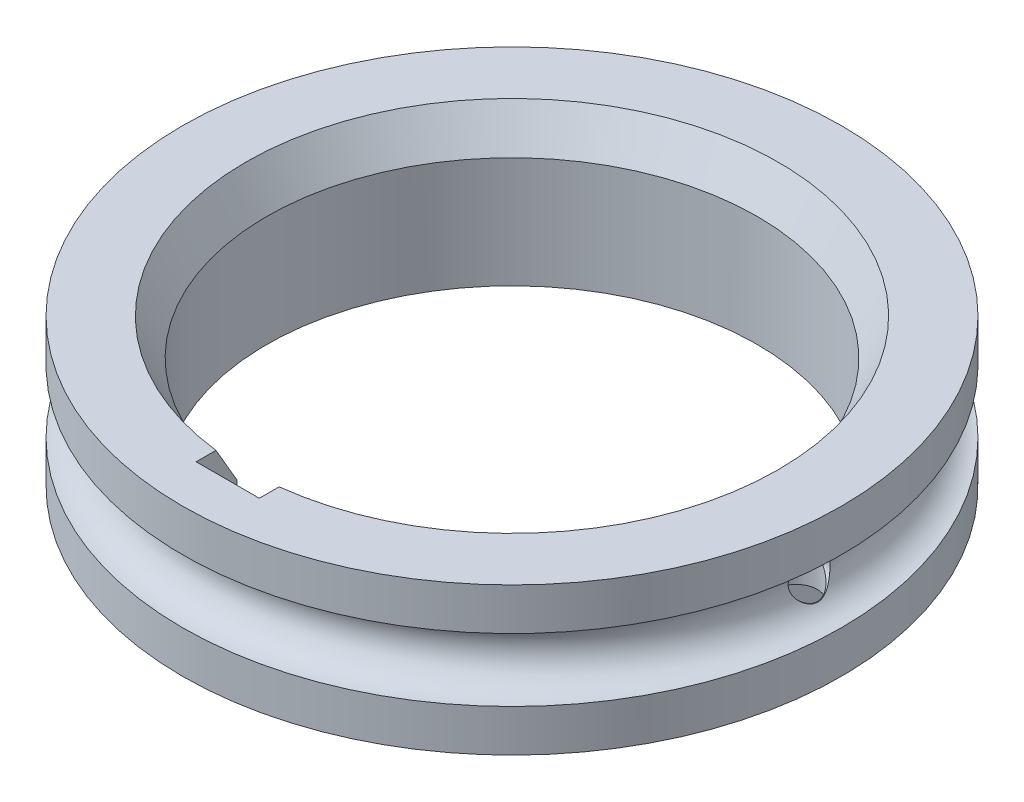
ISO-10303-21;
HEADER;
FILE_DESCRIPTION(('STEP AP214'),'2;1');
FILE_NAME('part.step','',(''),(''),'','','');
FILE_SCHEMA(('AUTOMOTIVE_DESIGN { 1 0 10303 214 1 1 1 1 }'));
ENDSEC;
DATA;
#1=APPLICATION_CONTEXT('core data for automotive mechanical design processes');
#2=APPLICATION_PROTOCOL_DEFINITION('international standard','automotive_design',2000,#1);
#3=PRODUCT_CONTEXT('',#1,'mechanical');
#4=PRODUCT('Part','Part','',(#3));
#5=PRODUCT_RELATED_PRODUCT_CATEGORY('part','',(#4));
#6=PRODUCT_DEFINITION_FORMATION('','',#4);
#7=PRODUCT_DEFINITION_CONTEXT('part definition',#1,'design');
#8=PRODUCT_DEFINITION('design','',#6,#7);
#9=PRODUCT_DEFINITION_SHAPE('','',#8);
#10=(LENGTH_UNIT() NAMED_UNIT(*) SI_UNIT(.MILLI.,.METRE.));
#11=(NAMED_UNIT(*) PLANE_ANGLE_UNIT() SI_UNIT($,.RADIAN.));
#12=(NAMED_UNIT(*) SI_UNIT($,.STERADIAN.) SOLID_ANGLE_UNIT());
#13=UNCERTAINTY_MEASURE_WITH_UNIT(LENGTH_MEASURE(1.E-05),#10,'distance_accuracy_value','');
#14=(GEOMETRIC_REPRESENTATION_CONTEXT(3) GLOBAL_UNCERTAINTY_ASSIGNED_CONTEXT((#13)) GLOBAL_UNIT_ASSIGNED_CONTEXT((#10,
#11,#12)) REPRESENTATION_CONTEXT('',''));
#15=CARTESIAN_POINT('',(0.,0.,0.));
#16=DIRECTION('',(0.,0.,1.));
#17=DIRECTION('',(1.,0.,0.));
#18=AXIS2_PLACEMENT_3D('',#15,#16,#17);
#19=CARTESIAN_POINT('',(0.,7.,0.));
#20=DIRECTION('',(0.,1.,0.));
#21=DIRECTION('',(0.,0.,1.));
#22=AXIS2_PLACEMENT_3D('',#19,#20,#21);
#23=PLANE('',#22);
#24=CARTESIAN_POINT('',(0.,7.,0.));
#25=DIRECTION('',(0.,1.,0.));
#26=DIRECTION('',(0.,0.,1.));
#27=AXIS2_PLACEMENT_3D('',#24,#25,#26);
#28=CIRCLE('',#27,15.65);
#29=CARTESIAN_POINT('',(0.,7.,15.65));
#30=VERTEX_POINT('',#29);
#31=EDGE_CURVE('E188',#30,#30,#28,.T.);
#32=ORIENTED_EDGE('',*,*,#31,.T.);
#33=EDGE_LOOP('',(#32));
#34=FACE_BOUND('',#33,.T.);
#35=CARTESIAN_POINT('',(0.,7.,0.));
#36=DIRECTION('',(0.,1.,0.));
#37=DIRECTION('',(0.,0.,1.));
#38=AXIS2_PLACEMENT_3D('',#35,#36,#37);
#39=CIRCLE('',#38,12.65);
#40=CARTESIAN_POINT('',(-1.5,7.,12.560752366001));
#41=VERTEX_POINT('',#40);
#42=CARTESIAN_POINT('',(1.5,7.,12.560752366001));
#43=VERTEX_POINT('',#42);
#44=EDGE_CURVE('E196',#41,#43,#39,.F.);
#45=ORIENTED_EDGE('',*,*,#44,.T.);
#46=DIRECTION('',(0.,0.,1.));
#47=VECTOR('',#46,1.);
#48=CARTESIAN_POINT('',(1.5,7.,0.));
#49=LINE('',#48,#47);
#50=CARTESIAN_POINT('',(1.5,7.,13.5));
#51=VERTEX_POINT('',#50);
#52=EDGE_CURVE('E342',#43,#51,#49,.T.);
#53=ORIENTED_EDGE('',*,*,#52,.T.);
#54=DIRECTION('',(-1.,0.,0.));
#55=VECTOR('',#54,1.);
#56=CARTESIAN_POINT('',(0.,7.,13.5));
#57=LINE('',#56,#55);
#58=CARTESIAN_POINT('',(-1.5,7.,13.5));
#59=VERTEX_POINT('',#58);
#60=EDGE_CURVE('E145',#51,#59,#57,.T.);
#61=ORIENTED_EDGE('',*,*,#60,.T.);
#62=DIRECTION('',(0.,0.,-1.));
#63=VECTOR('',#62,1.);
#64=CARTESIAN_POINT('',(-1.5,7.,0.));
#65=LINE('',#64,#63);
#66=EDGE_CURVE('E135',#59,#41,#65,.T.);
#67=ORIENTED_EDGE('',*,*,#66,.T.);
#68=EDGE_LOOP('',(#45,#53,#61,#67));
#69=FACE_BOUND('',#68,.T.);
#70=ADVANCED_FACE('F41',(#34,#69),#23,.T.);
#71=CARTESIAN_POINT('',(0.,7.,0.));
#72=DIRECTION('',(0.,-1.,0.));
#73=DIRECTION('',(0.,0.,-1.));
#74=AXIS2_PLACEMENT_3D('',#71,#72,#73);
#75=CYLINDRICAL_SURFACE('',#74,11.65);
#76=CARTESIAN_POINT('',(0.,0.,0.));
#77=DIRECTION('',(0.,1.,0.));
#78=DIRECTION('',(0.,0.,1.));
#79=AXIS2_PLACEMENT_3D('',#76,#77,#78);
#80=CIRCLE('',#79,11.65);
#81=CARTESIAN_POINT('',(0.,0.,11.65));
#82=VERTEX_POINT('',#81);
#83=EDGE_CURVE('E183',#82,#82,#80,.T.);
#84=ORIENTED_EDGE('',*,*,#83,.F.);
#85=EDGE_LOOP('',(#84));
#86=FACE_BOUND('',#85,.T.);
#87=CARTESIAN_POINT('',(0.,2.,0.));
#88=DIRECTION('',(0.,-1.,0.));
#89=DIRECTION('',(0.,0.,-1.));
#90=AXIS2_PLACEMENT_3D('',#87,#88,#89);
#91=CIRCLE('',#90,11.65);
#92=CARTESIAN_POINT('',(1.5,2.,11.5530299056135));
#93=VERTEX_POINT('',#92);
#94=CARTESIAN_POINT('',(-1.5,2.,11.5530299056135));
#95=VERTEX_POINT('',#94);
#96=EDGE_CURVE('E13',#93,#95,#91,.T.);
#97=ORIENTED_EDGE('',*,*,#96,.F.);
#98=DIRECTION('',(0.,-1.,0.));
#99=VECTOR('',#98,1.);
#100=CARTESIAN_POINT('',(1.5,7.,11.5530299056135));
#101=LINE('',#100,#99);
#102=CARTESIAN_POINT('',(1.5,5.26794919243111,11.5530299056135));
#103=VERTEX_POINT('',#102);
#104=EDGE_CURVE('E131',#93,#103,#101,.F.);
#105=ORIENTED_EDGE('',*,*,#104,.T.);
#106=CARTESIAN_POINT('',(0.,5.26794919243111,0.));
#107=DIRECTION('',(0.,1.,0.));
#108=DIRECTION('',(0.,0.,1.));
#109=AXIS2_PLACEMENT_3D('',#106,#107,#108);
#110=CIRCLE('',#109,11.65);
#111=CARTESIAN_POINT('',(-1.5,5.26794919243111,11.5530299056135));
#112=VERTEX_POINT('',#111);
#113=EDGE_CURVE('E191',#103,#112,#110,.T.);
#114=ORIENTED_EDGE('',*,*,#113,.T.);
#115=DIRECTION('',(0.,-1.,0.));
#116=VECTOR('',#115,1.);
#117=CARTESIAN_POINT('',(-1.5,7.,11.5530299056135));
#118=LINE('',#117,#116);
#119=EDGE_CURVE('E56',#112,#95,#118,.T.);
#120=ORIENTED_EDGE('',*,*,#119,.T.);
#121=EDGE_LOOP('',(#97,#105,#114,#120));
#122=FACE_BOUND('',#121,.T.);
#123=ADVANCED_FACE('F274',(#86,#122),#75,.F.);
#124=CARTESIAN_POINT('',(0.,5.26794919243111,0.));
#125=DIRECTION('',(0.,1.,0.));
#126=DIRECTION('',(0.,0.,1.));
#127=AXIS2_PLACEMENT_3D('',#124,#125,#126);
#128=CONICAL_SURFACE('',#127,11.65,0.523598775598299);
#129=ORIENTED_EDGE('',*,*,#113,.F.);
#130=CARTESIAN_POINT('',(1.5,-7.50027727997253,4.00668407312648));
#131=CARTESIAN_POINT('',(1.5,-7.29792213320085,4.13141607417199));
#132=CARTESIAN_POINT('',(1.5,-7.09526317837837,4.25565332553744));
#133=CARTESIAN_POINT('',(1.5,-6.68945247858701,4.50331809504595));
#134=CARTESIAN_POINT('',(1.5,-6.48630073637275,4.62674561770105));
#135=CARTESIAN_POINT('',(1.5,-6.07962058575542,4.87296992920971));
#136=CARTESIAN_POINT('',(1.5,-5.87609218400459,4.99576672906064));
#137=CARTESIAN_POINT('',(1.5,-5.46872814592801,5.2408502517817));
#138=CARTESIAN_POINT('',(1.5,-5.26489250910494,5.36313697382497));
#139=CARTESIAN_POINT('',(1.5,-4.65302736321365,5.72937132437671));
#140=CARTESIAN_POINT('',(1.5,-4.24462764464568,5.97270037037015));
#141=CARTESIAN_POINT('',(1.5,-3.42714761192463,6.45821648430531));
#142=CARTESIAN_POINT('',(1.5,-3.01806729392879,6.70040354576941));
#143=CARTESIAN_POINT('',(1.5,-1.79015880041738,7.42571118430243));
#144=CARTESIAN_POINT('',(1.5,-0.97060932673931,7.90761025918951));
#145=CARTESIAN_POINT('',(1.5,0.669568672486914,8.86956903967274));
#146=CARTESIAN_POINT('',(1.5,1.4901971999346,9.34962874202511));
#147=CARTESIAN_POINT('',(1.5,3.13213803067199,10.308579463693));
#148=CARTESIAN_POINT('',(1.5,3.95345033477879,10.7874704816094));
#149=CARTESIAN_POINT('',(1.5,5.59653043888195,11.7444705928169));
#150=CARTESIAN_POINT('',(1.5,6.41829823898299,12.2225796859284));
#151=CARTESIAN_POINT('',(1.5,8.88412068838099,13.6561281234769));
#152=CARTESIAN_POINT('',(1.5,10.5286448600458,14.6107597460249));
#153=CARTESIAN_POINT('',(1.5,13.8183615818812,16.5188644620983));
#154=CARTESIAN_POINT('',(1.5,15.463554131065,17.4723375573258));
#155=CARTESIAN_POINT('',(1.5,17.5521404854962,18.68217133689));
#156=CARTESIAN_POINT('',(1.5,17.9953414350382,18.9388649758188));
#157=CARTESIAN_POINT('',(1.5,18.8817663947982,19.4522030179352));
#158=CARTESIAN_POINT('',(1.5,19.3249904047661,19.7088474215545));
#159=CARTESIAN_POINT('',(1.5,19.7682264724036,19.9654709992121));
#160=B_SPLINE_CURVE_WITH_KNOTS('',3,(#130,#131,#132,#133,#134,#135,#136,#137,#138,#139,#140,
#141,#142,#143,#144,#145,#146,#147,#148,#149,#150,#151,#152,#153,#154,#155,#156,#157,#158,#159),
.UNSPECIFIED.,.F.,.F.,(4,2,2,2,2,2,2,2,2,2,2,2,2,2,4),(0.,0.71312556086909,1.42624714462131,
2.13935625178169,2.85246651448222,4.2786450728587,5.70483171118458,8.55701723670018,
11.4092077898318,14.2614017560995,17.1135963781043,22.8181576179204,28.5227104666232,
30.0592222128171,31.5957198041034),.UNSPECIFIED.);
#161=EDGE_CURVE('E49',#103,#43,#160,.T.);
#162=ORIENTED_EDGE('',*,*,#161,.T.);
#163=ORIENTED_EDGE('',*,*,#44,.F.);
#164=CARTESIAN_POINT('',(-1.5,19.7682264724036,19.9654709992121));
#165=CARTESIAN_POINT('',(-1.5,18.8055721861169,19.4081098834568));
#166=CARTESIAN_POINT('',(-1.5,17.8429697087624,18.8506592389178));
#167=CARTESIAN_POINT('',(-1.5,15.9179130784499,17.735500484024));
#168=CARTESIAN_POINT('',(-1.5,14.9554589255878,17.1777923735039));
#169=CARTESIAN_POINT('',(-1.5,13.0307247862914,16.0620293415487));
#170=CARTESIAN_POINT('',(-1.5,12.0684448039152,15.5039744131125));
#171=CARTESIAN_POINT('',(-1.5,10.1441531238375,14.3874033319668));
#172=CARTESIAN_POINT('',(-1.5,9.18214142599398,13.828887179502));
#173=CARTESIAN_POINT('',(-1.5,7.25859254618581,12.7112549316309));
#174=CARTESIAN_POINT('',(-1.5,6.29705532696649,12.1521389003612));
#175=CARTESIAN_POINT('',(-1.5,4.37454950938442,11.0329264657462));
#176=CARTESIAN_POINT('',(-1.5,3.41358091193097,10.4728300608387));
#177=CARTESIAN_POINT('',(-1.5,1.49254699854743,9.35110711660841));
#178=CARTESIAN_POINT('',(-1.5,0.532481675129577,8.78948059012269));
#179=CARTESIAN_POINT('',(-1.5,-0.906427529165991,7.94501750236563));
#180=CARTESIAN_POINT('',(-1.5,-1.38586518795976,7.66319295189088));
#181=CARTESIAN_POINT('',(-1.5,-2.34418491279036,7.09860107024865));
#182=CARTESIAN_POINT('',(-1.5,-2.82306697928013,6.8158337398505));
#183=CARTESIAN_POINT('',(-1.5,-3.65285769753751,6.3242838186436));
#184=CARTESIAN_POINT('',(-1.5,-4.00395061781106,6.11581242060094));
#185=CARTESIAN_POINT('',(-1.5,-4.70554990213532,5.69788828216726));
#186=CARTESIAN_POINT('',(-1.5,-5.05605626898813,5.48843554648256));
#187=CARTESIAN_POINT('',(-1.5,-5.7562617579336,5.06816799152765));
#188=CARTESIAN_POINT('',(-1.5,-6.10596086455266,4.8573531464379));
#189=CARTESIAN_POINT('',(-1.5,-6.62961516624062,4.53965000637807));
#190=CARTESIAN_POINT('',(-1.5,-6.80401890984436,4.43350130617158));
#191=CARTESIAN_POINT('',(-1.5,-7.1524500478866,4.22058655359869));
#192=CARTESIAN_POINT('',(-1.5,-7.32647744075615,4.11382049866542));
#193=CARTESIAN_POINT('',(-1.5,-7.50027727997253,4.00668407312648));
#194=B_SPLINE_CURVE_WITH_KNOTS('',3,(#164,#165,#166,#167,#168,#169,#170,#171,#172,#173,#174,
#175,#176,#177,#178,#179,#180,#181,#182,#183,#184,#185,#186,#187,#188,#189,#190,#191,#192,#193),
.UNSPECIFIED.,.F.,.F.,(4,2,2,2,2,2,2,2,2,2,2,2,2,2,4),(0.,3.33709340473402,6.67418895534874,
10.0113542145175,13.3485177049895,16.6853542558986,20.0221961285194,23.359010091972,
25.0274128055185,26.6958141579599,27.9207778961224,29.1457357655825,30.3707169233097,
30.9832171456538,31.5957199165356),.UNSPECIFIED.);
#195=EDGE_CURVE('E260',#41,#112,#194,.T.);
#196=ORIENTED_EDGE('',*,*,#195,.T.);
#197=EDGE_LOOP('',(#129,#162,#163,#196));
#198=FACE_BOUND('',#197,.T.);
#199=ADVANCED_FACE('F267',(#198),#128,.F.);
#200=CARTESIAN_POINT('',(0.,0.,0.));
#201=DIRECTION('',(0.,1.,0.));
#202=DIRECTION('',(0.,0.,1.));
#203=AXIS2_PLACEMENT_3D('',#200,#201,#202);
#204=PLANE('',#203);
#205=ORIENTED_EDGE('',*,*,#83,.T.);
#206=EDGE_LOOP('',(#205));
#207=FACE_BOUND('',#206,.T.);
#208=CARTESIAN_POINT('',(0.,0.,0.));
#209=DIRECTION('',(0.,1.,0.));
#210=DIRECTION('',(0.,0.,1.));
#211=AXIS2_PLACEMENT_3D('',#208,#209,#210);
#212=CIRCLE('',#211,15.65);
#213=CARTESIAN_POINT('',(0.,0.,15.65));
#214=VERTEX_POINT('',#213);
#215=EDGE_CURVE('E186',#214,#214,#212,.T.);
#216=ORIENTED_EDGE('',*,*,#215,.F.);
#217=EDGE_LOOP('',(#216));
#218=FACE_BOUND('',#217,.T.);
#219=CARTESIAN_POINT('',(0.,0.,0.));
#220=DIRECTION('',(0.,1.,0.));
#221=DIRECTION('',(0.,0.,1.));
#222=AXIS2_PLACEMENT_3D('',#219,#220,#221);
#223=CIRCLE('',#222,14.5);
#224=CARTESIAN_POINT('',(14.5,0.,0.));
#225=VERTEX_POINT('',#224);
#226=CARTESIAN_POINT('',(-14.5,0.,0.));
#227=VERTEX_POINT('',#226);
#228=EDGE_CURVE('E153',#225,#227,#223,.T.);
#229=ORIENTED_EDGE('',*,*,#228,.T.);
#230=CARTESIAN_POINT('',(-13.5,0.,0.));
#231=DIRECTION('',(0.,1.,0.));
#232=DIRECTION('',(0.,0.,1.));
#233=AXIS2_PLACEMENT_3D('',#230,#231,#232);
#234=CIRCLE('',#233,1.);
#235=CARTESIAN_POINT('',(-12.5,0.,0.));
#236=VERTEX_POINT('',#235);
#237=EDGE_CURVE('E179',#236,#227,#234,.F.);
#238=ORIENTED_EDGE('',*,*,#237,.F.);
#239=CARTESIAN_POINT('',(0.,0.,0.));
#240=DIRECTION('',(0.,1.,0.));
#241=DIRECTION('',(0.,0.,1.));
#242=AXIS2_PLACEMENT_3D('',#239,#240,#241);
#243=CIRCLE('',#242,12.5);
#244=CARTESIAN_POINT('',(12.5,0.,0.));
#245=VERTEX_POINT('',#244);
#246=EDGE_CURVE('E156',#245,#236,#243,.T.);
#247=ORIENTED_EDGE('',*,*,#246,.F.);
#248=CARTESIAN_POINT('',(13.5,0.,0.));
#249=DIRECTION('',(0.,1.,0.));
#250=DIRECTION('',(0.,0.,1.));
#251=AXIS2_PLACEMENT_3D('',#248,#249,#250);
#252=CIRCLE('',#251,1.);
#253=EDGE_CURVE('E175',#225,#245,#252,.F.);
#254=ORIENTED_EDGE('',*,*,#253,.F.);
#255=EDGE_LOOP('',(#229,#238,#247,#254));
#256=FACE_BOUND('',#255,.T.);
#257=ADVANCED_FACE('F273',(#207,#218,#256),#204,.F.);
#258=CARTESIAN_POINT('',(0.,7.,0.));
#259=DIRECTION('',(0.,-1.,0.));
#260=DIRECTION('',(0.,0.,-1.));
#261=AXIS2_PLACEMENT_3D('',#258,#259,#260);
#262=CYLINDRICAL_SURFACE('',#261,15.65);
#263=CARTESIAN_POINT('',(0.,2.,0.));
#264=DIRECTION('',(0.,1.,0.));
#265=DIRECTION('',(0.,0.,1.));
#266=AXIS2_PLACEMENT_3D('',#263,#264,#265);
#267=CIRCLE('',#266,15.65);
#268=CARTESIAN_POINT('',(0.,2.,15.65));
#269=VERTEX_POINT('',#268);
#270=EDGE_CURVE('E187',#269,#269,#267,.F.);
#271=ORIENTED_EDGE('',*,*,#270,.T.);
#272=EDGE_LOOP('',(#271));
#273=FACE_BOUND('',#272,.T.);
#274=ORIENTED_EDGE('',*,*,#215,.T.);
#275=EDGE_LOOP('',(#274));
#276=FACE_BOUND('',#275,.T.);
#277=ADVANCED_FACE('F295',(#273,#276),#262,.T.);
#278=CARTESIAN_POINT('',(0.,5.,0.));
#279=DIRECTION('',(0.,-1.,0.));
#280=DIRECTION('',(0.,0.,-1.));
#281=AXIS2_PLACEMENT_3D('',#278,#279,#280);
#282=CIRCLE('',#281,15.65);
#283=CARTESIAN_POINT('',(0.,5.,-15.65));
#284=VERTEX_POINT('',#283);
#285=EDGE_CURVE('E200',#284,#284,#282,.F.);
#286=ORIENTED_EDGE('',*,*,#285,.T.);
#287=EDGE_LOOP('',(#286));
#288=FACE_BOUND('',#287,.T.);
#289=ORIENTED_EDGE('',*,*,#31,.F.);
#290=EDGE_LOOP('',(#289));
#291=FACE_BOUND('',#290,.T.);
#292=ADVANCED_FACE('F276',(#288,#291),#262,.T.);
#293=CARTESIAN_POINT('',(0.,3.5,0.));
#294=DIRECTION('',(0.,-1.,0.));
#295=DIRECTION('',(0.,0.,-1.));
#296=AXIS2_PLACEMENT_3D('',#293,#294,#295);
#297=TOROIDAL_SURFACE('',#296,15.65,1.5);
#298=CARTESIAN_POINT('',(-14.4014689039551,2.65400313999999,-0.533187877647396));
#299=CARTESIAN_POINT('',(-14.3779520258994,2.68568897040616,-0.583463465449917));
#300=CARTESIAN_POINT('',(-14.3532041572367,2.72158017105834,-0.630512625187718));
#301=CARTESIAN_POINT('',(-14.3040241672074,2.80116227853623,-0.717712181525872));
#302=CARTESIAN_POINT('',(-14.2795922288137,2.84485750563459,-0.757858732588904));
#303=CARTESIAN_POINT('',(-14.2333385643971,2.93992983962871,-0.830618001196258));
#304=CARTESIAN_POINT('',(-14.2115349563691,2.99135532247386,-0.863179724250342));
#305=CARTESIAN_POINT('',(-14.1732347661313,3.10081213400222,-0.918908991722866));
#306=CARTESIAN_POINT('',(-14.1567242517695,3.15882556737272,-0.942101240506153));
#307=CARTESIAN_POINT('',(-14.1347817984924,3.26286786695551,-0.972543162882006));
#308=CARTESIAN_POINT('',(-14.127546717543,3.30775240967901,-0.98243135411719));
#309=CARTESIAN_POINT('',(-14.1176245457552,3.39894459774398,-0.995945091785392));
#310=CARTESIAN_POINT('',(-14.1149343269643,3.44525124197276,-0.999574945487547));
#311=CARTESIAN_POINT('',(-14.1143576687228,3.53800046031141,-1.00035492807308));
#312=CARTESIAN_POINT('',(-14.1164767125824,3.58444312922334,-0.99749766062439));
#313=CARTESIAN_POINT('',(-14.1253244130179,3.67605367309008,-0.985465127102288));
#314=CARTESIAN_POINT('',(-14.1320548846236,3.72122103880233,-0.976287373316685));
#315=CARTESIAN_POINT('',(-14.1494828268282,3.80890536622727,-0.952174714882514));
#316=CARTESIAN_POINT('',(-14.1601601224687,3.85143454426615,-0.937269074363628));
#317=CARTESIAN_POINT('',(-14.1846695529244,3.93333557744184,-0.902333017687216));
#318=CARTESIAN_POINT('',(-14.1985023535046,3.97270676391621,-0.882301519940589));
#319=CARTESIAN_POINT('',(-14.2305419886166,4.05314221296491,-0.834577043346933));
#320=CARTESIAN_POINT('',(-14.2490904698858,4.09366408476744,-0.806202390086176));
#321=CARTESIAN_POINT('',(-14.2878073337468,4.16969806526744,-0.744254345242815));
#322=CARTESIAN_POINT('',(-14.3079779423796,4.20520309873161,-0.710673748885909));
#323=CARTESIAN_POINT('',(-14.3524008495929,4.27715796668032,-0.631969986216756));
#324=CARTESIAN_POINT('',(-14.3767018857149,4.31251040317801,-0.585865527533573));
#325=CARTESIAN_POINT('',(-14.4230032105815,4.37511975823438,-0.487402589263869));
#326=CARTESIAN_POINT('',(-14.4450057620474,4.40238468805588,-0.435050371131954));
#327=CARTESIAN_POINT('',(-14.4781574452756,4.44149911191732,-0.339780906392255));
#328=CARTESIAN_POINT('',(-14.4906276272459,4.45552583660231,-0.298223465787129));
#329=CARTESIAN_POINT('',(-14.5111909281427,4.47812896082923,-0.212637715819611));
#330=CARTESIAN_POINT('',(-14.5192920806794,4.48671536894456,-0.168614106901517));
#331=CARTESIAN_POINT('',(-14.5299450052378,4.49792729726606,-0.0787591930148719));
#332=CARTESIAN_POINT('',(-14.5324527165886,4.50050549665281,-0.0329164107091672));
#333=CARTESIAN_POINT('',(-14.5313202740394,4.49932939070363,0.0586151132131702));
#334=CARTESIAN_POINT('',(-14.5276794219638,4.49557436622385,0.104303836745984));
#335=CARTESIAN_POINT('',(-14.5155870591328,4.48277035346496,0.189249016922239));
#336=CARTESIAN_POINT('',(-14.5076777754256,4.47431532203542,0.228678850584003));
#337=CARTESIAN_POINT('',(-14.4884233799041,4.4530386104195,0.305462350550839));
#338=CARTESIAN_POINT('',(-14.4770753109576,4.44021317077895,0.342814197071188));
#339=CARTESIAN_POINT('',(-14.4459331446873,4.40349209626597,0.432496778122579));
#340=CARTESIAN_POINT('',(-14.424704970685,4.3772405341107,0.483365558568248));
#341=CARTESIAN_POINT('',(-14.3799691174152,4.31709025276638,0.579293003767662));
#342=CARTESIAN_POINT('',(-14.3564567529094,4.28317561821013,0.624339265239404));
#343=CARTESIAN_POINT('',(-14.3091721176178,4.20759669935029,0.708926943845049));
#344=CARTESIAN_POINT('',(-14.2854024844386,4.16580735403193,0.748358415786999));
#345=CARTESIAN_POINT('',(-14.2402902357193,4.07531923224387,0.819954316101142));
#346=CARTESIAN_POINT('',(-14.2189436720973,4.02663199476092,0.852130652709298));
#347=CARTESIAN_POINT('',(-14.1843942000156,3.93269378690796,0.902809787211338));
#348=CARTESIAN_POINT('',(-14.1704148820577,3.8885040835127,0.922744507066147));
#349=CARTESIAN_POINT('',(-14.1466134105874,3.79669898429859,0.956217111204832));
#350=CARTESIAN_POINT('',(-14.1367882387563,3.74908610522307,0.969759640760558));
#351=CARTESIAN_POINT('',(-14.1221959509501,3.65131367729213,0.98975052017683));
#352=CARTESIAN_POINT('',(-14.1174589897813,3.60114077189881,0.99615658465368));
#353=CARTESIAN_POINT('',(-14.1136792058988,3.50019213143188,1.0012746769039));
#354=CARTESIAN_POINT('',(-14.114634494731,3.4494166018628,0.999989256394503));
#355=CARTESIAN_POINT('',(-14.1217547595069,3.35393180642397,0.99032501051525));
#356=CARTESIAN_POINT('',(-14.1274080974342,3.30910998560016,0.982642678836653));
#357=CARTESIAN_POINT('',(-14.142756629555,3.22157814092558,0.961514301984427));
#358=CARTESIAN_POINT('',(-14.1524528717818,3.17886866786775,0.948066762282934));
#359=CARTESIAN_POINT('',(-14.1757118751216,3.09430889322579,0.915192294029685));
#360=CARTESIAN_POINT('',(-14.1894451939254,3.05261094681156,0.895497658787632));
#361=CARTESIAN_POINT('',(-14.2195504369911,2.97303425656563,0.851108401968624));
#362=CARTESIAN_POINT('',(-14.2359229735474,2.93515640231222,0.826412619792047));
#363=CARTESIAN_POINT('',(-14.2733395700413,2.85718180026591,0.767832081092152));
#364=CARTESIAN_POINT('',(-14.2946977930412,2.81787660312123,0.733094666479453));
#365=CARTESIAN_POINT('',(-14.3380299282791,2.74521897326131,0.658057983826265));
#366=CARTESIAN_POINT('',(-14.3600051292289,2.711880269498,0.61774625735394));
#367=CARTESIAN_POINT('',(-14.4060507792734,2.64687927697708,0.525231836451445));
#368=CARTESIAN_POINT('',(-14.4299110402125,2.61629556384848,0.472155511056875));
#369=CARTESIAN_POINT('',(-14.4723680897083,2.56486602206482,0.359605896588226));
#370=CARTESIAN_POINT('',(-14.4909840300959,2.54398457514062,0.300157007739968));
#371=CARTESIAN_POINT('',(-14.5138673561021,2.51901970564756,0.19840193207609));
#372=CARTESIAN_POINT('',(-14.5208837476831,2.51160221057952,0.15753258085841));
#373=CARTESIAN_POINT('',(-14.5300957690342,2.50192347462202,0.0746738197893862));
#374=CARTESIAN_POINT('',(-14.5322981196293,2.49965504501355,0.0326860543988266));
#375=CARTESIAN_POINT('',(-14.5315510293883,2.50043099443897,-0.051237438677895));
#376=CARTESIAN_POINT('',(-14.5285958686311,2.50348127216451,-0.0931730569051551));
#377=CARTESIAN_POINT('',(-14.5179767851414,2.51468258044546,-0.175760943827509));
#378=CARTESIAN_POINT('',(-14.5103068795862,2.52284009212043,-0.216411512824736));
#379=CARTESIAN_POINT('',(-14.4887075553473,2.54658811637381,-0.306093573362356));
#380=CARTESIAN_POINT('',(-14.4736558480192,2.56357854330956,-0.354478422567198));
#381=CARTESIAN_POINT('',(-14.4398494857771,2.60406289923233,-0.447058948774561));
#382=CARTESIAN_POINT('',(-14.4210875494805,2.62756965365705,-0.491246131241313));
#383=CARTESIAN_POINT('',(-14.4014689039551,2.65400313999999,-0.533187877647396));
#384=B_SPLINE_CURVE_WITH_KNOTS('',3,(#298,#299,#300,#301,#302,#303,#304,#305,#306,#307,#308,
#309,#310,#311,#312,#313,#314,#315,#316,#317,#318,#319,#320,#321,#322,#323,#324,#325,#326,#327,
#328,#329,#330,#331,#332,#333,#334,#335,#336,#337,#338,#339,#340,#341,#342,#343,#344,#345,#346,
#347,#348,#349,#350,#351,#352,#353,#354,#355,#356,#357,#358,#359,#360,#361,#362,#363,#364,#365,
#366,#367,#368,#369,#370,#371,#372,#373,#374,#375,#376,#377,#378,#379,#380,#381,#382,#383),
.UNSPECIFIED.,.T.,.F.,(4,2,2,2,2,2,2,2,2,2,2,2,2,2,2,2,2,2,2,2,2,2,2,2,2,2,2,2,2,2,2,2,2,2,2,2,
2,2,2,2,2,2,4),(0.,0.191542851012909,0.383192069798627,0.576094819224383,0.768485571904263,
0.907462734723041,1.04634420897389,1.18538410932143,1.32447876638713,1.46287203066728,
1.60129452093779,1.75921067392912,1.9173473590747,2.10546918037721,2.29340402622963,
2.42970257662182,2.56574964430116,2.70286465319307,2.83999523267844,2.96280171648802,
3.08571410704536,3.26789392105429,3.45045563845488,3.63620741573606,3.82165205277834,
3.97240216663971,4.12304255949731,4.27457086486406,4.42604890218166,4.56290910328714,
4.69980480444406,4.84361498692042,4.98745858127346,5.15673186900089,5.32638978369093,
5.52259463447207,5.71807338728964,5.84392040782252,5.96959162232314,6.09540230065694,
6.22137295822995,6.38084891995274,6.54064101854813),.UNSPECIFIED.);
#385=CARTESIAN_POINT('',(-14.4014689039551,2.65400313999999,-0.533187877647396));
#386=VERTEX_POINT('',#385);
#387=EDGE_CURVE('E182',#386,#386,#384,.T.);
#388=ORIENTED_EDGE('',*,*,#387,.T.);
#389=EDGE_LOOP('',(#388));
#390=FACE_BOUND('',#389,.T.);
#391=CARTESIAN_POINT('',(14.3209476880208,2.77391421505463,-0.68760412792804));
#392=CARTESIAN_POINT('',(14.3437866910521,2.73613712610621,-0.647714349170683));
#393=CARTESIAN_POINT('',(14.3669033899523,2.70167078220494,-0.604748598372975));
#394=CARTESIAN_POINT('',(14.4115013860199,2.63985833213628,-0.51305028317376));
#395=CARTESIAN_POINT('',(14.4329794925345,2.6125258785844,-0.464306917133431));
#396=CARTESIAN_POINT('',(14.4675267680863,2.57077525458702,-0.372201164594562));
#397=CARTESIAN_POINT('',(14.48141546605,2.55485256847151,-0.329836724488623));
#398=CARTESIAN_POINT('',(14.5048412427404,2.5287224876792,-0.242278179288526));
#399=CARTESIAN_POINT('',(14.514387989789,2.51850238329764,-0.197090618442045));
#400=CARTESIAN_POINT('',(14.5277453303112,2.50435262244267,-0.104401948778295));
#401=CARTESIAN_POINT('',(14.53149948937,2.50048483037984,-0.0568826756235058));
#402=CARTESIAN_POINT('',(14.5323492063103,2.49960167966644,0.0382807044049739));
#403=CARTESIAN_POINT('',(14.5294459316406,2.50258511958277,0.0859247879284248));
#404=CARTESIAN_POINT('',(14.5183892685098,2.51424722067056,0.173083972520192));
#405=CARTESIAN_POINT('',(14.5110088658894,2.52209047124971,0.212819140048693));
#406=CARTESIAN_POINT('',(14.4926611159094,2.54222159958186,0.290283477923264));
#407=CARTESIAN_POINT('',(14.4816905317754,2.55451348912589,0.32801080225481));
#408=CARTESIAN_POINT('',(14.4515660406743,2.58969041661784,0.417877552950525));
#409=CARTESIAN_POINT('',(14.4309710364075,2.61484663620843,0.468643795151093));
#410=CARTESIAN_POINT('',(14.3872919535913,2.67268855106347,0.564537844472012));
#411=CARTESIAN_POINT('',(14.3642028932805,2.70538947014211,0.609653962807162));
#412=CARTESIAN_POINT('',(14.317482679608,2.77843962747112,0.694656898486027));
#413=CARTESIAN_POINT('',(14.2938495556596,2.81892226455487,0.734428195957561));
#414=CARTESIAN_POINT('',(14.2486884218863,2.90669764102731,0.806985244892637));
#415=CARTESIAN_POINT('',(14.2271573897822,2.95398035413342,0.839781107740732));
#416=CARTESIAN_POINT('',(14.191539947786,3.04634640289354,0.892485774688278));
#417=CARTESIAN_POINT('',(14.1768106428791,3.09047151073689,0.913633038876289));
#418=CARTESIAN_POINT('',(14.1514451838455,3.18237928807771,0.949497135272189));
#419=CARTESIAN_POINT('',(14.1408061958648,3.23015939769982,0.964218420488517));
#420=CARTESIAN_POINT('',(14.1245934562203,3.32855571383034,0.986491120784241));
#421=CARTESIAN_POINT('',(14.119052526068,3.37918810069473,0.993996090660557));
#422=CARTESIAN_POINT('',(14.1137860609663,3.48130177824087,1.00113220837628));
#423=CARTESIAN_POINT('',(14.1140578993153,3.53278267498536,1.00076691266815));
#424=CARTESIAN_POINT('',(14.1200355320249,3.62930790598692,0.992660954186401));
#425=CARTESIAN_POINT('',(14.1251646854454,3.6744580337933,0.985702910330888));
#426=CARTESIAN_POINT('',(14.1395680087668,3.76275761020312,0.96592268930713));
#427=CARTESIAN_POINT('',(14.14884318667,3.80590656945487,0.953099086056957));
#428=CARTESIAN_POINT('',(14.171240875461,3.89097816908829,0.921562198374756));
#429=CARTESIAN_POINT('',(14.1845014994915,3.9327841291263,0.90263531643727));
#430=CARTESIAN_POINT('',(14.2137431304084,4.01268328016221,0.859775356207738));
#431=CARTESIAN_POINT('',(14.2297247275421,4.05077566276672,0.835841191452363));
#432=CARTESIAN_POINT('',(14.2663322586656,4.12916187762513,0.77902937865191));
#433=CARTESIAN_POINT('',(14.2872837164409,4.16870106944321,0.745321114206493));
#434=CARTESIAN_POINT('',(14.3299864480732,4.24198586135251,0.672410313461062));
#435=CARTESIAN_POINT('',(14.351739342462,4.27571884114315,0.633196137059906));
#436=CARTESIAN_POINT('',(14.3977689520657,4.34202125788437,0.542810320613482));
#437=CARTESIAN_POINT('',(14.4218732677454,4.3734893042314,0.490732606910799));
#438=CARTESIAN_POINT('',(14.4653273872694,4.42694429554227,0.380151433087638));
#439=CARTESIAN_POINT('',(14.484692264532,4.44896147124616,0.321669224140238));
#440=CARTESIAN_POINT('',(14.5093992395996,4.47618327374841,0.220827542860915));
#441=CARTESIAN_POINT('',(14.517276357834,4.48457300958515,0.179951610208532));
#442=CARTESIAN_POINT('',(14.5282667836223,4.49617690839593,0.0968692363670954));
#443=CARTESIAN_POINT('',(14.531387669214,4.49939930484692,0.0546650212666782));
#444=CARTESIAN_POINT('',(14.5323974460966,4.50044817208039,-0.029965298461366));
#445=CARTESIAN_POINT('',(14.5302752558603,4.49826321410722,-0.0723916836120866));
#446=CARTESIAN_POINT('',(14.5211118827805,4.48863918075746,-0.15612283649734));
#447=CARTESIAN_POINT('',(14.5140640813466,4.48119303572583,-0.197426017300212));
#448=CARTESIAN_POINT('',(14.4938440310058,4.45913785630778,-0.287563246119184));
#449=CARTESIAN_POINT('',(14.4796107413688,4.44324238575432,-0.335838445118694));
#450=CARTESIAN_POINT('',(14.4472537440241,4.40500714420219,-0.428343276076136));
#451=CARTESIAN_POINT('',(14.429124477695,4.38265814975312,-0.472566997604597));
#452=CARTESIAN_POINT('',(14.3905363820393,4.3316566289001,-0.557542651859435));
#453=CARTESIAN_POINT('',(14.3700361975015,4.30288011219959,-0.598200707107936));
#454=CARTESIAN_POINT('',(14.3287336380892,4.23971653713761,-0.674746887486581));
#455=CARTESIAN_POINT('',(14.3079310873643,4.20532608429741,-0.710632102735925));
#456=CARTESIAN_POINT('',(14.2631136673081,4.12310109880789,-0.784493108500628));
#457=CARTESIAN_POINT('',(14.2393862938678,4.07396990718123,-0.821221177452701));
#458=CARTESIAN_POINT('',(14.1963419818421,3.96839835331193,-0.885667357939971));
#459=CARTESIAN_POINT('',(14.1770174943564,3.91197076546122,-0.913400925971702));
#460=CARTESIAN_POINT('',(14.1496402837033,3.80955623284815,-0.951994705316612));
#461=CARTESIAN_POINT('',(14.1399493660302,3.76496142941382,-0.965397421364945));
#462=CARTESIAN_POINT('',(14.1250094043733,3.67363785612323,-0.985917693418813));
#463=CARTESIAN_POINT('',(14.1197561345259,3.62691116122067,-0.993041229216209));
#464=CARTESIAN_POINT('',(14.1141816138026,3.5324767391768,-1.00059753332642));
#465=CARTESIAN_POINT('',(14.113875306187,3.48476647539261,-1.00101002966869));
#466=CARTESIAN_POINT('',(14.1182640052322,3.39000451292226,-0.995065543764931));
#467=CARTESIAN_POINT('',(14.1229596540378,3.34295289957854,-0.988707692350319));
#468=CARTESIAN_POINT('',(14.1366058070681,3.25276559661311,-0.970006137024571));
#469=CARTESIAN_POINT('',(14.1453755728122,3.20954847345805,-0.957916291099099));
#470=CARTESIAN_POINT('',(14.1663943517683,3.12585068023438,-0.928430898169663));
#471=CARTESIAN_POINT('',(14.178646005701,3.08537211609192,-0.911031323439261));
#472=CARTESIAN_POINT('',(14.2072983131529,3.00343586239016,-0.869348670116398));
#473=CARTESIAN_POINT('',(14.22400873378,2.96236924092968,-0.844515520495345));
#474=CARTESIAN_POINT('',(14.2594788336071,2.88482374093129,-0.78981491746814));
#475=CARTESIAN_POINT('',(14.2782358593938,2.84833905097212,-0.759953955929076));
#476=CARTESIAN_POINT('',(14.3051959329554,2.80041878314218,-0.714806167608341));
#477=CARTESIAN_POINT('',(14.313055229525,2.78696881757851,-0.701388811209326));
#478=CARTESIAN_POINT('',(14.3209476880208,2.77391421505463,-0.68760412792804));
#479=B_SPLINE_CURVE_WITH_KNOTS('',3,(#391,#392,#393,#394,#395,#396,#397,#398,#399,#400,#401,
#402,#403,#404,#405,#406,#407,#408,#409,#410,#411,#412,#413,#414,#415,#416,#417,#418,#419,#420,
#421,#422,#423,#424,#425,#426,#427,#428,#429,#430,#431,#432,#433,#434,#435,#436,#437,#438,#439,
#440,#441,#442,#443,#444,#445,#446,#447,#448,#449,#450,#451,#452,#453,#454,#455,#456,#457,#458,
#459,#460,#461,#462,#463,#464,#465,#466,#467,#468,#469,#470,#471,#472,#473,#474,#475,#476,#477,
#478),.UNSPECIFIED.,.T.,.F.,(4,2,2,2,2,2,2,2,2,2,2,2,2,2,2,2,2,2,2,2,2,2,2,2,2,2,2,2,2,2,2,2,2,
2,2,2,2,2,2,2,2,2,2,4),(0.,0.178446951050719,0.357232944918211,0.498731332418967,
0.639913080785168,0.782461799794278,0.924985523346565,1.04800168134512,1.17112905310569,
1.35101399999962,1.53126514618345,1.71493785095992,1.89834246674501,2.05102616514975,
2.2036038897633,2.35715717975197,2.51064108281706,2.64792312802794,2.78523856810848,
2.9280051018013,3.07080264468158,3.23824456011239,3.40604595084293,3.60141184781453,
3.79614807982995,3.92302254836045,4.0496946574873,4.17663472398246,4.30374568981779,
4.46123042264196,4.61894135800806,4.78000754584438,4.94117148591071,5.13744606715171,
5.33338155309654,5.47547302941019,5.61742904245297,5.75981378127487,5.90221680147139,
6.03883054270272,6.17554817178687,6.32745877095417,6.47917470787074,6.54084049743824),.UNSPECIFIED.);
#480=CARTESIAN_POINT('',(14.3209476880208,2.77391421505463,-0.68760412792804));
#481=VERTEX_POINT('',#480);
#482=EDGE_CURVE('E178',#481,#481,#479,.T.);
#483=ORIENTED_EDGE('',*,*,#482,.T.);
#484=EDGE_LOOP('',(#483));
#485=FACE_BOUND('',#484,.T.);
#486=ORIENTED_EDGE('',*,*,#285,.F.);
#487=EDGE_LOOP('',(#486));
#488=FACE_BOUND('',#487,.T.);
#489=ORIENTED_EDGE('',*,*,#270,.F.);
#490=EDGE_LOOP('',(#489));
#491=FACE_BOUND('',#490,.T.);
#492=ADVANCED_FACE('F217',(#390,#485,#488,#491),#297,.F.);
#493=CARTESIAN_POINT('',(-11.2,3.5,0.));
#494=DIRECTION('',(-1.,0.,0.));
#495=DIRECTION('',(0.,-1.,0.));
#496=AXIS2_PLACEMENT_3D('',#493,#494,#495);
#497=CYLINDRICAL_SURFACE('',#496,1.);
#498=ORIENTED_EDGE('',*,*,#387,.F.);
#499=EDGE_LOOP('',(#498));
#500=FACE_BOUND('',#499,.T.);
#501=CARTESIAN_POINT('',(-13.5,3.5,0.));
#502=DIRECTION('',(-1.,0.,0.));
#503=DIRECTION('',(0.,-1.,0.));
#504=AXIS2_PLACEMENT_3D('',#501,#502,#503);
#505=CIRCLE('',#504,1.);
#506=CARTESIAN_POINT('',(-13.5,3.5,-1.));
#507=VERTEX_POINT('',#506);
#508=CARTESIAN_POINT('',(-13.5,3.5,1.));
#509=VERTEX_POINT('',#508);
#510=EDGE_CURVE('E322',#507,#509,#505,.F.);
#511=ORIENTED_EDGE('',*,*,#510,.T.);
#512=CARTESIAN_POINT('',(-13.5,3.5,0.));
#513=DIRECTION('',(-0.707106781186548,0.707106781186547,0.));
#514=DIRECTION('',(0.707106781186547,0.707106781186548,0.));
#515=AXIS2_PLACEMENT_3D('',#512,#513,#514);
#516=ELLIPSE('',#515,1.41421356237309,1.);
#517=EDGE_CURVE('E314',#509,#507,#516,.F.);
#518=ORIENTED_EDGE('',*,*,#517,.T.);
#519=EDGE_LOOP('',(#511,#518));
#520=FACE_BOUND('',#519,.T.);
#521=ADVANCED_FACE('F220',(#500,#520),#497,.F.);
#522=CARTESIAN_POINT('',(-13.5,-5.,0.));
#523=DIRECTION('',(0.,1.,0.));
#524=DIRECTION('',(0.,0.,1.));
#525=AXIS2_PLACEMENT_3D('',#522,#523,#524);
#526=CYLINDRICAL_SURFACE('',#525,1.);
#527=CARTESIAN_POINT('',(-13.5,2.,0.));
#528=DIRECTION('',(0.,1.,0.));
#529=DIRECTION('',(0.,0.,1.));
#530=AXIS2_PLACEMENT_3D('',#527,#528,#529);
#531=CIRCLE('',#530,1.);
#532=CARTESIAN_POINT('',(-14.5,2.,0.));
#533=VERTEX_POINT('',#532);
#534=CARTESIAN_POINT('',(-12.5,2.,0.));
#535=VERTEX_POINT('',#534);
#536=EDGE_CURVE('E172',#533,#535,#531,.F.);
#537=ORIENTED_EDGE('',*,*,#536,.T.);
#538=DIRECTION('',(0.,-1.,0.));
#539=VECTOR('',#538,1.);
#540=CARTESIAN_POINT('',(-12.5,2.,0.));
#541=LINE('',#540,#539);
#542=EDGE_CURVE('E167',#535,#236,#541,.T.);
#543=ORIENTED_EDGE('',*,*,#542,.T.);
#544=ORIENTED_EDGE('',*,*,#237,.T.);
#545=DIRECTION('',(0.,-1.,0.));
#546=VECTOR('',#545,1.);
#547=CARTESIAN_POINT('',(-14.5,2.,0.));
#548=LINE('',#547,#546);
#549=EDGE_CURVE('E170',#533,#227,#548,.T.);
#550=ORIENTED_EDGE('',*,*,#549,.F.);
#551=EDGE_LOOP('',(#537,#543,#544,#550));
#552=FACE_BOUND('',#551,.T.);
#553=CARTESIAN_POINT('',(-13.5,3.5,0.));
#554=DIRECTION('',(0.,1.,0.));
#555=DIRECTION('',(0.,0.,1.));
#556=AXIS2_PLACEMENT_3D('',#553,#554,#555);
#557=CIRCLE('',#556,1.);
#558=EDGE_CURVE('E319',#509,#507,#557,.T.);
#559=ORIENTED_EDGE('',*,*,#558,.T.);
#560=ORIENTED_EDGE('',*,*,#517,.F.);
#561=EDGE_LOOP('',(#559,#560));
#562=FACE_BOUND('',#561,.T.);
#563=ADVANCED_FACE('F224',(#552,#562),#526,.F.);
#564=CARTESIAN_POINT('',(11.2,3.5,0.));
#565=DIRECTION('',(1.,0.,0.));
#566=DIRECTION('',(0.,1.,0.));
#567=AXIS2_PLACEMENT_3D('',#564,#565,#566);
#568=CYLINDRICAL_SURFACE('',#567,1.);
#569=ORIENTED_EDGE('',*,*,#482,.F.);
#570=EDGE_LOOP('',(#569));
#571=FACE_BOUND('',#570,.T.);
#572=CARTESIAN_POINT('',(13.5,3.5,0.));
#573=DIRECTION('',(1.,0.,0.));
#574=DIRECTION('',(0.,1.,0.));
#575=AXIS2_PLACEMENT_3D('',#572,#573,#574);
#576=CIRCLE('',#575,1.);
#577=CARTESIAN_POINT('',(13.5,3.5,1.));
#578=VERTEX_POINT('',#577);
#579=CARTESIAN_POINT('',(13.5,3.5,-1.));
#580=VERTEX_POINT('',#579);
#581=EDGE_CURVE('E199',#578,#580,#576,.F.);
#582=ORIENTED_EDGE('',*,*,#581,.T.);
#583=CARTESIAN_POINT('',(13.5,3.5,0.));
#584=DIRECTION('',(0.707106781186548,0.707106781186547,0.));
#585=DIRECTION('',(-0.707106781186547,0.707106781186548,0.));
#586=AXIS2_PLACEMENT_3D('',#583,#584,#585);
#587=ELLIPSE('',#586,1.41421356237309,1.);
#588=EDGE_CURVE('E315',#580,#578,#587,.F.);
#589=ORIENTED_EDGE('',*,*,#588,.T.);
#590=EDGE_LOOP('',(#582,#589));
#591=FACE_BOUND('',#590,.T.);
#592=ADVANCED_FACE('F227',(#571,#591),#568,.F.);
#593=CARTESIAN_POINT('',(13.5,-5.,0.));
#594=DIRECTION('',(0.,1.,0.));
#595=DIRECTION('',(0.,0.,1.));
#596=AXIS2_PLACEMENT_3D('',#593,#594,#595);
#597=CYLINDRICAL_SURFACE('',#596,1.);
#598=CARTESIAN_POINT('',(13.5,2.,0.));
#599=DIRECTION('',(0.,1.,0.));
#600=DIRECTION('',(0.,0.,1.));
#601=AXIS2_PLACEMENT_3D('',#598,#599,#600);
#602=CIRCLE('',#601,1.);
#603=CARTESIAN_POINT('',(12.5,2.,0.));
#604=VERTEX_POINT('',#603);
#605=CARTESIAN_POINT('',(14.5,2.,0.));
#606=VERTEX_POINT('',#605);
#607=EDGE_CURVE('E313',#604,#606,#602,.F.);
#608=ORIENTED_EDGE('',*,*,#607,.T.);
#609=DIRECTION('',(0.,-1.,0.));
#610=VECTOR('',#609,1.);
#611=CARTESIAN_POINT('',(14.5,2.,0.));
#612=LINE('',#611,#610);
#613=EDGE_CURVE('E159',#606,#225,#612,.T.);
#614=ORIENTED_EDGE('',*,*,#613,.T.);
#615=ORIENTED_EDGE('',*,*,#253,.T.);
#616=DIRECTION('',(0.,-1.,0.));
#617=VECTOR('',#616,1.);
#618=CARTESIAN_POINT('',(12.5,2.,0.));
#619=LINE('',#618,#617);
#620=EDGE_CURVE('E165',#604,#245,#619,.T.);
#621=ORIENTED_EDGE('',*,*,#620,.F.);
#622=EDGE_LOOP('',(#608,#614,#615,#621));
#623=FACE_BOUND('',#622,.T.);
#624=CARTESIAN_POINT('',(13.5,3.5,0.));
#625=DIRECTION('',(0.,1.,0.));
#626=DIRECTION('',(0.,0.,1.));
#627=AXIS2_PLACEMENT_3D('',#624,#625,#626);
#628=CIRCLE('',#627,1.);
#629=EDGE_CURVE('E325',#580,#578,#628,.T.);
#630=ORIENTED_EDGE('',*,*,#629,.T.);
#631=ORIENTED_EDGE('',*,*,#588,.F.);
#632=EDGE_LOOP('',(#630,#631));
#633=FACE_BOUND('',#632,.T.);
#634=ADVANCED_FACE('F232',(#623,#633),#597,.F.);
#635=CARTESIAN_POINT('',(13.5,3.5,0.));
#636=DIRECTION('',(0.,0.,1.));
#637=DIRECTION('',(1.,0.,0.));
#638=AXIS2_PLACEMENT_3D('',#635,#636,#637);
#639=SPHERICAL_SURFACE('',#638,1.);
#640=ORIENTED_EDGE('',*,*,#581,.F.);
#641=ORIENTED_EDGE('',*,*,#629,.F.);
#642=EDGE_LOOP('',(#640,#641));
#643=FACE_BOUND('',#642,.T.);
#644=ADVANCED_FACE('F236',(#643),#639,.F.);
#645=CARTESIAN_POINT('',(-13.5,3.5,0.));
#646=DIRECTION('',(0.,0.,1.));
#647=DIRECTION('',(1.,0.,0.));
#648=AXIS2_PLACEMENT_3D('',#645,#646,#647);
#649=SPHERICAL_SURFACE('',#648,1.);
#650=ORIENTED_EDGE('',*,*,#510,.F.);
#651=ORIENTED_EDGE('',*,*,#558,.F.);
#652=EDGE_LOOP('',(#650,#651));
#653=FACE_BOUND('',#652,.T.);
#654=ADVANCED_FACE('F43',(#653),#649,.F.);
#655=CARTESIAN_POINT('',(0.,2.,0.));
#656=DIRECTION('',(0.,1.,0.));
#657=DIRECTION('',(0.,0.,1.));
#658=AXIS2_PLACEMENT_3D('',#655,#656,#657);
#659=PLANE('',#658);
#660=CARTESIAN_POINT('',(0.,2.,0.));
#661=DIRECTION('',(0.,1.,0.));
#662=DIRECTION('',(0.,0.,1.));
#663=AXIS2_PLACEMENT_3D('',#660,#661,#662);
#664=CIRCLE('',#663,14.5);
#665=EDGE_CURVE('E64',#606,#533,#664,.T.);
#666=ORIENTED_EDGE('',*,*,#665,.F.);
#667=ORIENTED_EDGE('',*,*,#607,.F.);
#668=CARTESIAN_POINT('',(0.,2.,0.));
#669=DIRECTION('',(0.,1.,0.));
#670=DIRECTION('',(0.,0.,1.));
#671=AXIS2_PLACEMENT_3D('',#668,#669,#670);
#672=CIRCLE('',#671,12.5);
#673=EDGE_CURVE('E155',#604,#535,#672,.T.);
#674=ORIENTED_EDGE('',*,*,#673,.T.);
#675=ORIENTED_EDGE('',*,*,#536,.F.);
#676=EDGE_LOOP('',(#666,#667,#674,#675));
#677=FACE_BOUND('',#676,.T.);
#678=ADVANCED_FACE('F242',(#677),#659,.F.);
#679=CARTESIAN_POINT('',(0.,2.,0.));
#680=DIRECTION('',(0.,-1.,0.));
#681=DIRECTION('',(0.,0.,-1.));
#682=AXIS2_PLACEMENT_3D('',#679,#680,#681);
#683=CYLINDRICAL_SURFACE('',#682,14.5);
#684=ORIENTED_EDGE('',*,*,#228,.F.);
#685=ORIENTED_EDGE('',*,*,#613,.F.);
#686=ORIENTED_EDGE('',*,*,#665,.T.);
#687=ORIENTED_EDGE('',*,*,#549,.T.);
#688=EDGE_LOOP('',(#684,#685,#686,#687));
#689=FACE_BOUND('',#688,.T.);
#690=ADVANCED_FACE('F238',(#689),#683,.F.);
#691=CARTESIAN_POINT('',(0.,2.,0.));
#692=DIRECTION('',(0.,-1.,0.));
#693=DIRECTION('',(0.,0.,-1.));
#694=AXIS2_PLACEMENT_3D('',#691,#692,#693);
#695=CYLINDRICAL_SURFACE('',#694,12.5);
#696=ORIENTED_EDGE('',*,*,#246,.T.);
#697=ORIENTED_EDGE('',*,*,#542,.F.);
#698=ORIENTED_EDGE('',*,*,#673,.F.);
#699=ORIENTED_EDGE('',*,*,#620,.T.);
#700=EDGE_LOOP('',(#696,#697,#698,#699));
#701=FACE_BOUND('',#700,.T.);
#702=ADVANCED_FACE('F241',(#701),#695,.T.);
#703=CARTESIAN_POINT('',(1.5,2.,0.));
#704=DIRECTION('',(-1.,0.,0.));
#705=DIRECTION('',(0.,0.,1.));
#706=AXIS2_PLACEMENT_3D('',#703,#704,#705);
#707=PLANE('',#706);
#708=DIRECTION('',(0.,0.,1.));
#709=VECTOR('',#708,1.);
#710=CARTESIAN_POINT('',(1.5,2.,0.));
#711=LINE('',#710,#709);
#712=CARTESIAN_POINT('',(1.5,2.,13.5));
#713=VERTEX_POINT('',#712);
#714=EDGE_CURVE('E124',#93,#713,#711,.T.);
#715=ORIENTED_EDGE('',*,*,#714,.T.);
#716=DIRECTION('',(0.,1.,0.));
#717=VECTOR('',#716,1.);
#718=CARTESIAN_POINT('',(1.5,2.,13.5));
#719=LINE('',#718,#717);
#720=EDGE_CURVE('E128',#713,#51,#719,.T.);
#721=ORIENTED_EDGE('',*,*,#720,.T.);
#722=ORIENTED_EDGE('',*,*,#52,.F.);
#723=ORIENTED_EDGE('',*,*,#161,.F.);
#724=ORIENTED_EDGE('',*,*,#104,.F.);
#725=EDGE_LOOP('',(#715,#721,#722,#723,#724));
#726=FACE_BOUND('',#725,.T.);
#727=ADVANCED_FACE('F126',(#726),#707,.T.);
#728=CARTESIAN_POINT('',(0.,2.,13.5));
#729=DIRECTION('',(0.,0.,-1.));
#730=DIRECTION('',(-1.,0.,0.));
#731=AXIS2_PLACEMENT_3D('',#728,#729,#730);
#732=PLANE('',#731);
#733=ORIENTED_EDGE('',*,*,#60,.F.);
#734=ORIENTED_EDGE('',*,*,#720,.F.);
#735=DIRECTION('',(-1.,0.,0.));
#736=VECTOR('',#735,1.);
#737=CARTESIAN_POINT('',(0.,2.,13.5));
#738=LINE('',#737,#736);
#739=CARTESIAN_POINT('',(-1.5,2.,13.5));
#740=VERTEX_POINT('',#739);
#741=EDGE_CURVE('E134',#713,#740,#738,.T.);
#742=ORIENTED_EDGE('',*,*,#741,.T.);
#743=DIRECTION('',(0.,1.,0.));
#744=VECTOR('',#743,1.);
#745=CARTESIAN_POINT('',(-1.5,2.,13.5));
#746=LINE('',#745,#744);
#747=EDGE_CURVE('E146',#740,#59,#746,.T.);
#748=ORIENTED_EDGE('',*,*,#747,.T.);
#749=EDGE_LOOP('',(#733,#734,#742,#748));
#750=FACE_BOUND('',#749,.T.);
#751=ADVANCED_FACE('F143',(#750),#732,.T.);
#752=CARTESIAN_POINT('',(-1.5,2.,0.));
#753=DIRECTION('',(1.,0.,0.));
#754=DIRECTION('',(0.,0.,-1.));
#755=AXIS2_PLACEMENT_3D('',#752,#753,#754);
#756=PLANE('',#755);
#757=ORIENTED_EDGE('',*,*,#195,.F.);
#758=ORIENTED_EDGE('',*,*,#66,.F.);
#759=ORIENTED_EDGE('',*,*,#747,.F.);
#760=DIRECTION('',(0.,0.,-1.));
#761=VECTOR('',#760,1.);
#762=CARTESIAN_POINT('',(-1.5,2.,0.));
#763=LINE('',#762,#761);
#764=EDGE_CURVE('E139',#740,#95,#763,.T.);
#765=ORIENTED_EDGE('',*,*,#764,.T.);
#766=ORIENTED_EDGE('',*,*,#119,.F.);
#767=EDGE_LOOP('',(#757,#758,#759,#765,#766));
#768=FACE_BOUND('',#767,.T.);
#769=ADVANCED_FACE('F339',(#768),#756,.T.);
#770=CARTESIAN_POINT('',(0.,2.,0.));
#771=DIRECTION('',(0.,-1.,0.));
#772=DIRECTION('',(0.,0.,-1.));
#773=AXIS2_PLACEMENT_3D('',#770,#771,#772);
#774=PLANE('',#773);
#775=ORIENTED_EDGE('',*,*,#96,.T.);
#776=ORIENTED_EDGE('',*,*,#764,.F.);
#777=ORIENTED_EDGE('',*,*,#741,.F.);
#778=ORIENTED_EDGE('',*,*,#714,.F.);
#779=EDGE_LOOP('',(#775,#776,#777,#778));
#780=FACE_BOUND('',#779,.T.);
#781=ADVANCED_FACE('F138',(#780),#774,.F.);
#782=CLOSED_SHELL('',(#70,#123,#199,#257,#277,#292,#492,#521,#563,#592,#634,#644,#654,#678,#690,
#702,#727,#751,#769,#781));
#783=MANIFOLD_SOLID_BREP('B2',#782);
#784=ADVANCED_BREP_SHAPE_REPRESENTATION('',(#18,#783),#14);
#785=SHAPE_DEFINITION_REPRESENTATION(#9,#784);
ENDSEC;
END-ISO-10303-21;
